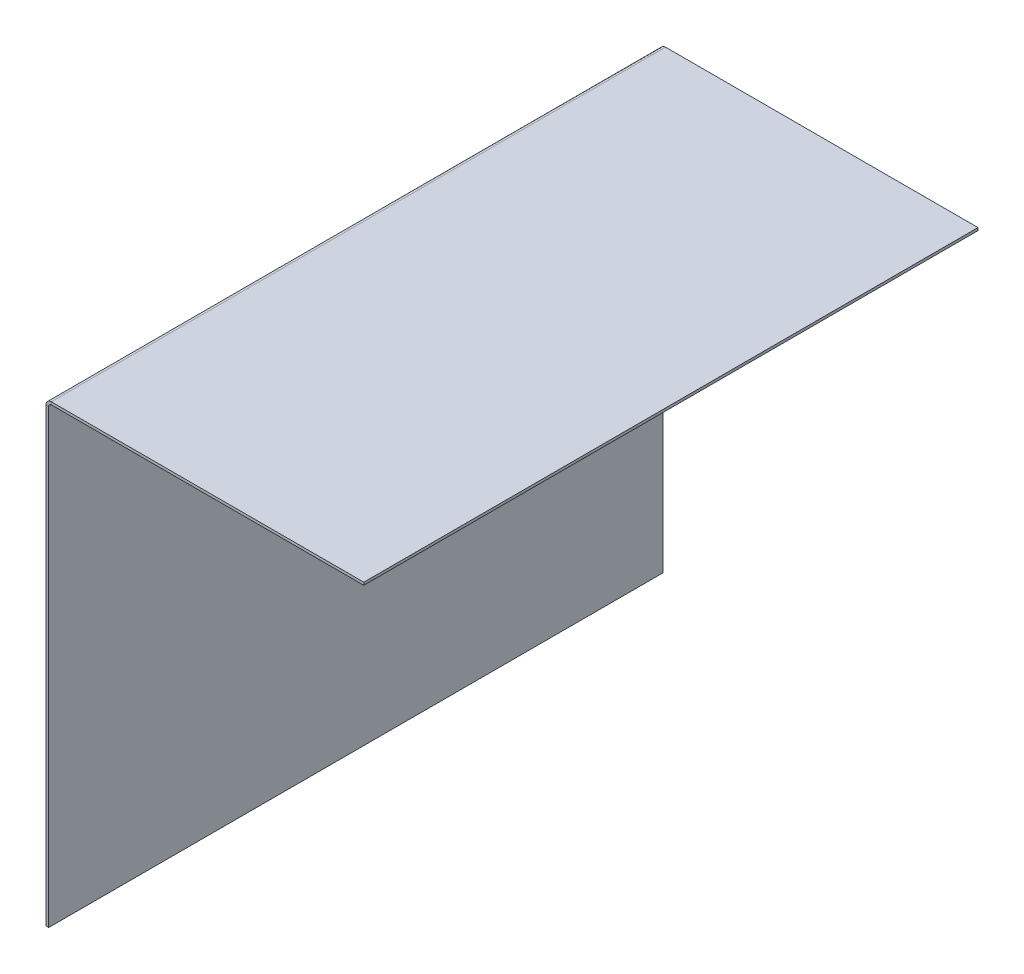
ISO-10303-21;
HEADER;
FILE_DESCRIPTION(('STEP AP214'),'2;1');
FILE_NAME('part.step','',(''),(''),'','','');
FILE_SCHEMA(('AUTOMOTIVE_DESIGN { 1 0 10303 214 1 1 1 1 }'));
ENDSEC;
DATA;
#1=APPLICATION_CONTEXT('core data for automotive mechanical design processes');
#2=APPLICATION_PROTOCOL_DEFINITION('international standard','automotive_design',2000,#1);
#3=PRODUCT_CONTEXT('',#1,'mechanical');
#4=PRODUCT('Part','Part','',(#3));
#5=PRODUCT_RELATED_PRODUCT_CATEGORY('part','',(#4));
#6=PRODUCT_DEFINITION_FORMATION('','',#4);
#7=PRODUCT_DEFINITION_CONTEXT('part definition',#1,'design');
#8=PRODUCT_DEFINITION('design','',#6,#7);
#9=PRODUCT_DEFINITION_SHAPE('','',#8);
#10=(LENGTH_UNIT() NAMED_UNIT(*) SI_UNIT(.MILLI.,.METRE.));
#11=(NAMED_UNIT(*) PLANE_ANGLE_UNIT() SI_UNIT($,.RADIAN.));
#12=(NAMED_UNIT(*) SI_UNIT($,.STERADIAN.) SOLID_ANGLE_UNIT());
#13=UNCERTAINTY_MEASURE_WITH_UNIT(LENGTH_MEASURE(1.E-05),#10,'distance_accuracy_value','');
#14=(GEOMETRIC_REPRESENTATION_CONTEXT(3) GLOBAL_UNCERTAINTY_ASSIGNED_CONTEXT((#13)) GLOBAL_UNIT_ASSIGNED_CONTEXT((#10,
#11,#12)) REPRESENTATION_CONTEXT('',''));
#15=CARTESIAN_POINT('',(0.,0.,0.));
#16=DIRECTION('',(0.,0.,1.));
#17=DIRECTION('',(1.,0.,0.));
#18=AXIS2_PLACEMENT_3D('',#15,#16,#17);
#19=CARTESIAN_POINT('',(0.,-1.,115.));
#20=DIRECTION('',(0.,0.,1.));
#21=DIRECTION('',(1.,0.,0.));
#22=AXIS2_PLACEMENT_3D('',#19,#20,#21);
#23=PLANE('',#22);
#24=DIRECTION('',(-1.,0.,0.));
#25=VECTOR('',#24,1.);
#26=CARTESIAN_POINT('',(0.,-1.,115.));
#27=LINE('',#26,#25);
#28=CARTESIAN_POINT('',(0.,-1.,115.));
#29=VERTEX_POINT('',#28);
#30=CARTESIAN_POINT('',(-1.,-1.,115.));
#31=VERTEX_POINT('',#30);
#32=EDGE_CURVE('E11',#29,#31,#27,.T.);
#33=ORIENTED_EDGE('',*,*,#32,.F.);
#34=CARTESIAN_POINT('',(1.,-1.,115.));
#35=DIRECTION('',(0.,0.,-1.));
#36=DIRECTION('',(-1.,0.,0.));
#37=AXIS2_PLACEMENT_3D('',#34,#35,#36);
#38=CIRCLE('',#37,1.);
#39=CARTESIAN_POINT('',(1.,0.,115.));
#40=VERTEX_POINT('',#39);
#41=EDGE_CURVE('E132',#40,#29,#38,.F.);
#42=ORIENTED_EDGE('',*,*,#41,.F.);
#43=DIRECTION('',(0.,-1.,0.));
#44=VECTOR('',#43,1.);
#45=CARTESIAN_POINT('',(1.,1.,115.));
#46=LINE('',#45,#44);
#47=CARTESIAN_POINT('',(1.,1.,115.));
#48=VERTEX_POINT('',#47);
#49=EDGE_CURVE('E43',#48,#40,#46,.T.);
#50=ORIENTED_EDGE('',*,*,#49,.F.);
#51=CARTESIAN_POINT('',(1.,-1.,115.));
#52=DIRECTION('',(0.,0.,1.));
#53=DIRECTION('',(1.,0.,0.));
#54=AXIS2_PLACEMENT_3D('',#51,#52,#53);
#55=CIRCLE('',#54,2.);
#56=EDGE_CURVE('E125',#48,#31,#55,.T.);
#57=ORIENTED_EDGE('',*,*,#56,.T.);
#58=EDGE_LOOP('',(#33,#42,#50,#57));
#59=FACE_BOUND('',#58,.T.);
#60=ADVANCED_FACE('F35',(#59),#23,.T.);
#61=CARTESIAN_POINT('',(1.,1.,115.));
#62=DIRECTION('',(0.,0.,1.));
#63=DIRECTION('',(1.,0.,0.));
#64=AXIS2_PLACEMENT_3D('',#61,#62,#63);
#65=PLANE('',#64);
#66=DIRECTION('',(0.,-1.,0.));
#67=VECTOR('',#66,1.);
#68=CARTESIAN_POINT('',(0.,0.,115.));
#69=LINE('',#68,#67);
#70=CARTESIAN_POINT('',(0.,-170.,115.));
#71=VERTEX_POINT('',#70);
#72=EDGE_CURVE('E181',#29,#71,#69,.T.);
#73=ORIENTED_EDGE('',*,*,#72,.F.);
#74=ORIENTED_EDGE('',*,*,#32,.T.);
#75=DIRECTION('',(0.,-1.,0.));
#76=VECTOR('',#75,1.);
#77=CARTESIAN_POINT('',(-1.,0.,115.));
#78=LINE('',#77,#76);
#79=CARTESIAN_POINT('',(-0.999999999999979,-170.,115.));
#80=VERTEX_POINT('',#79);
#81=EDGE_CURVE('E91',#31,#80,#78,.T.);
#82=ORIENTED_EDGE('',*,*,#81,.T.);
#83=DIRECTION('',(-1.,0.,0.));
#84=VECTOR('',#83,1.);
#85=CARTESIAN_POINT('',(0.,-170.,115.));
#86=LINE('',#85,#84);
#87=EDGE_CURVE('E338',#71,#80,#86,.T.);
#88=ORIENTED_EDGE('',*,*,#87,.F.);
#89=EDGE_LOOP('',(#73,#74,#82,#88));
#90=FACE_BOUND('',#89,.T.);
#91=ADVANCED_FACE('F189',(#90),#65,.T.);
#92=CARTESIAN_POINT('',(1.,0.,-115.));
#93=DIRECTION('',(0.,0.,-1.));
#94=DIRECTION('',(-1.,0.,0.));
#95=AXIS2_PLACEMENT_3D('',#92,#93,#94);
#96=PLANE('',#95);
#97=DIRECTION('',(0.,1.,0.));
#98=VECTOR('',#97,1.);
#99=CARTESIAN_POINT('',(1.,0.,-115.));
#100=LINE('',#99,#98);
#101=CARTESIAN_POINT('',(1.,0.,-115.));
#102=VERTEX_POINT('',#101);
#103=CARTESIAN_POINT('',(1.,1.,-115.));
#104=VERTEX_POINT('',#103);
#105=EDGE_CURVE('E78',#102,#104,#100,.T.);
#106=ORIENTED_EDGE('',*,*,#105,.F.);
#107=CARTESIAN_POINT('',(1.,-1.,-115.));
#108=DIRECTION('',(0.,0.,-1.));
#109=DIRECTION('',(-1.,0.,0.));
#110=AXIS2_PLACEMENT_3D('',#107,#108,#109);
#111=CIRCLE('',#110,1.);
#112=CARTESIAN_POINT('',(0.,-1.,-115.));
#113=VERTEX_POINT('',#112);
#114=EDGE_CURVE('E147',#102,#113,#111,.F.);
#115=ORIENTED_EDGE('',*,*,#114,.T.);
#116=DIRECTION('',(1.,0.,0.));
#117=VECTOR('',#116,1.);
#118=CARTESIAN_POINT('',(-1.,-1.,-115.));
#119=LINE('',#118,#117);
#120=CARTESIAN_POINT('',(-1.,-1.,-115.));
#121=VERTEX_POINT('',#120);
#122=EDGE_CURVE('E85',#121,#113,#119,.T.);
#123=ORIENTED_EDGE('',*,*,#122,.F.);
#124=CARTESIAN_POINT('',(1.,-1.,-115.));
#125=DIRECTION('',(0.,0.,1.));
#126=DIRECTION('',(1.,0.,0.));
#127=AXIS2_PLACEMENT_3D('',#124,#125,#126);
#128=CIRCLE('',#127,2.);
#129=EDGE_CURVE('E154',#104,#121,#128,.T.);
#130=ORIENTED_EDGE('',*,*,#129,.F.);
#131=EDGE_LOOP('',(#106,#115,#123,#130));
#132=FACE_BOUND('',#131,.T.);
#133=ADVANCED_FACE('F187',(#132),#96,.T.);
#134=CARTESIAN_POINT('',(-1.,-1.,-115.));
#135=DIRECTION('',(0.,0.,-1.));
#136=DIRECTION('',(-1.,0.,0.));
#137=AXIS2_PLACEMENT_3D('',#134,#135,#136);
#138=PLANE('',#137);
#139=DIRECTION('',(-1.,0.,0.));
#140=VECTOR('',#139,1.);
#141=CARTESIAN_POINT('',(0.,0.,-115.));
#142=LINE('',#141,#140);
#143=CARTESIAN_POINT('',(118.,0.,-115.));
#144=VERTEX_POINT('',#143);
#145=EDGE_CURVE('E149',#144,#102,#142,.T.);
#146=ORIENTED_EDGE('',*,*,#145,.T.);
#147=ORIENTED_EDGE('',*,*,#105,.T.);
#148=DIRECTION('',(1.,0.,0.));
#149=VECTOR('',#148,1.);
#150=CARTESIAN_POINT('',(0.,1.,-115.));
#151=LINE('',#150,#149);
#152=CARTESIAN_POINT('',(118.,1.,-115.));
#153=VERTEX_POINT('',#152);
#154=EDGE_CURVE('E152',#153,#104,#151,.F.);
#155=ORIENTED_EDGE('',*,*,#154,.F.);
#156=DIRECTION('',(0.,-1.,0.));
#157=VECTOR('',#156,1.);
#158=CARTESIAN_POINT('',(118.,1.,-115.));
#159=LINE('',#158,#157);
#160=EDGE_CURVE('E113',#153,#144,#159,.T.);
#161=ORIENTED_EDGE('',*,*,#160,.T.);
#162=EDGE_LOOP('',(#146,#147,#155,#161));
#163=FACE_BOUND('',#162,.T.);
#164=ADVANCED_FACE('F183',(#163),#138,.T.);
#165=CARTESIAN_POINT('',(-1.,0.,115.));
#166=DIRECTION('',(1.,0.,0.));
#167=DIRECTION('',(0.,1.,0.));
#168=AXIS2_PLACEMENT_3D('',#165,#166,#167);
#169=PLANE('',#168);
#170=DIRECTION('',(0.,-1.,0.));
#171=VECTOR('',#170,1.);
#172=CARTESIAN_POINT('',(-1.,0.,-115.));
#173=LINE('',#172,#171);
#174=CARTESIAN_POINT('',(-0.999999999999979,-170.,-115.));
#175=VERTEX_POINT('',#174);
#176=EDGE_CURVE('E138',#121,#175,#173,.T.);
#177=ORIENTED_EDGE('',*,*,#176,.T.);
#178=DIRECTION('',(0.,0.,-1.));
#179=VECTOR('',#178,1.);
#180=CARTESIAN_POINT('',(-0.999999999999979,-170.,115.));
#181=LINE('',#180,#179);
#182=EDGE_CURVE('E168',#80,#175,#181,.T.);
#183=ORIENTED_EDGE('',*,*,#182,.F.);
#184=ORIENTED_EDGE('',*,*,#81,.F.);
#185=DIRECTION('',(0.,0.,-1.));
#186=VECTOR('',#185,1.);
#187=CARTESIAN_POINT('',(-1.,-1.,115.));
#188=LINE('',#187,#186);
#189=EDGE_CURVE('E137',#31,#121,#188,.T.);
#190=ORIENTED_EDGE('',*,*,#189,.T.);
#191=EDGE_LOOP('',(#177,#183,#184,#190));
#192=FACE_BOUND('',#191,.T.);
#193=ADVANCED_FACE('F195',(#192),#169,.F.);
#194=CARTESIAN_POINT('',(0.,-170.,115.));
#195=DIRECTION('',(0.,-1.,0.));
#196=DIRECTION('',(0.,0.,-1.));
#197=AXIS2_PLACEMENT_3D('',#194,#195,#196);
#198=PLANE('',#197);
#199=DIRECTION('',(-1.,0.,0.));
#200=VECTOR('',#199,1.);
#201=CARTESIAN_POINT('',(0.,-170.,-115.));
#202=LINE('',#201,#200);
#203=CARTESIAN_POINT('',(0.,-170.,-115.));
#204=VERTEX_POINT('',#203);
#205=EDGE_CURVE('E141',#204,#175,#202,.T.);
#206=ORIENTED_EDGE('',*,*,#205,.F.);
#207=DIRECTION('',(0.,0.,-1.));
#208=VECTOR('',#207,1.);
#209=CARTESIAN_POINT('',(0.,-170.,115.));
#210=LINE('',#209,#208);
#211=EDGE_CURVE('E166',#71,#204,#210,.T.);
#212=ORIENTED_EDGE('',*,*,#211,.F.);
#213=ORIENTED_EDGE('',*,*,#87,.T.);
#214=ORIENTED_EDGE('',*,*,#182,.T.);
#215=EDGE_LOOP('',(#206,#212,#213,#214));
#216=FACE_BOUND('',#215,.T.);
#217=ADVANCED_FACE('F226',(#216),#198,.T.);
#218=CARTESIAN_POINT('',(0.,0.,115.));
#219=DIRECTION('',(1.,0.,0.));
#220=DIRECTION('',(0.,1.,0.));
#221=AXIS2_PLACEMENT_3D('',#218,#219,#220);
#222=PLANE('',#221);
#223=DIRECTION('',(0.,-1.,0.));
#224=VECTOR('',#223,1.);
#225=CARTESIAN_POINT('',(0.,0.,-115.));
#226=LINE('',#225,#224);
#227=EDGE_CURVE('E144',#113,#204,#226,.T.);
#228=ORIENTED_EDGE('',*,*,#227,.F.);
#229=DIRECTION('',(0.,0.,-1.));
#230=VECTOR('',#229,1.);
#231=CARTESIAN_POINT('',(0.,-1.,115.));
#232=LINE('',#231,#230);
#233=EDGE_CURVE('E163',#29,#113,#232,.T.);
#234=ORIENTED_EDGE('',*,*,#233,.F.);
#235=ORIENTED_EDGE('',*,*,#72,.T.);
#236=ORIENTED_EDGE('',*,*,#211,.T.);
#237=EDGE_LOOP('',(#228,#234,#235,#236));
#238=FACE_BOUND('',#237,.T.);
#239=ADVANCED_FACE('F237',(#238),#222,.T.);
#240=CARTESIAN_POINT('',(1.,-1.,115.));
#241=DIRECTION('',(0.,0.,-1.));
#242=DIRECTION('',(-1.,0.,0.));
#243=AXIS2_PLACEMENT_3D('',#240,#241,#242);
#244=CYLINDRICAL_SURFACE('',#243,1.);
#245=ORIENTED_EDGE('',*,*,#114,.F.);
#246=DIRECTION('',(0.,0.,-1.));
#247=VECTOR('',#246,1.);
#248=CARTESIAN_POINT('',(1.,0.,115.));
#249=LINE('',#248,#247);
#250=EDGE_CURVE('E160',#40,#102,#249,.T.);
#251=ORIENTED_EDGE('',*,*,#250,.F.);
#252=ORIENTED_EDGE('',*,*,#41,.T.);
#253=ORIENTED_EDGE('',*,*,#233,.T.);
#254=EDGE_LOOP('',(#245,#251,#252,#253));
#255=FACE_BOUND('',#254,.T.);
#256=ADVANCED_FACE('F177',(#255),#244,.F.);
#257=CARTESIAN_POINT('',(0.,0.,115.));
#258=DIRECTION('',(0.,-1.,0.));
#259=DIRECTION('',(0.,0.,-1.));
#260=AXIS2_PLACEMENT_3D('',#257,#258,#259);
#261=PLANE('',#260);
#262=ORIENTED_EDGE('',*,*,#145,.F.);
#263=DIRECTION('',(0.,0.,-1.));
#264=VECTOR('',#263,1.);
#265=CARTESIAN_POINT('',(118.,0.,115.));
#266=LINE('',#265,#264);
#267=CARTESIAN_POINT('',(118.,0.,115.));
#268=VERTEX_POINT('',#267);
#269=EDGE_CURVE('E115',#268,#144,#266,.T.);
#270=ORIENTED_EDGE('',*,*,#269,.F.);
#271=DIRECTION('',(-1.,0.,0.));
#272=VECTOR('',#271,1.);
#273=CARTESIAN_POINT('',(0.,0.,115.));
#274=LINE('',#273,#272);
#275=EDGE_CURVE('E130',#268,#40,#274,.T.);
#276=ORIENTED_EDGE('',*,*,#275,.T.);
#277=ORIENTED_EDGE('',*,*,#250,.T.);
#278=EDGE_LOOP('',(#262,#270,#276,#277));
#279=FACE_BOUND('',#278,.T.);
#280=ADVANCED_FACE('F182',(#279),#261,.T.);
#281=CARTESIAN_POINT('',(118.,1.,115.));
#282=DIRECTION('',(1.,0.,0.));
#283=DIRECTION('',(0.,0.,-1.));
#284=AXIS2_PLACEMENT_3D('',#281,#282,#283);
#285=PLANE('',#284);
#286=ORIENTED_EDGE('',*,*,#160,.F.);
#287=DIRECTION('',(0.,0.,-1.));
#288=VECTOR('',#287,1.);
#289=CARTESIAN_POINT('',(118.,1.,115.));
#290=LINE('',#289,#288);
#291=CARTESIAN_POINT('',(118.,1.,115.));
#292=VERTEX_POINT('',#291);
#293=EDGE_CURVE('E107',#292,#153,#290,.T.);
#294=ORIENTED_EDGE('',*,*,#293,.F.);
#295=DIRECTION('',(0.,-1.,0.));
#296=VECTOR('',#295,1.);
#297=CARTESIAN_POINT('',(118.,1.,115.));
#298=LINE('',#297,#296);
#299=EDGE_CURVE('E111',#292,#268,#298,.T.);
#300=ORIENTED_EDGE('',*,*,#299,.T.);
#301=ORIENTED_EDGE('',*,*,#269,.T.);
#302=EDGE_LOOP('',(#286,#294,#300,#301));
#303=FACE_BOUND('',#302,.T.);
#304=ADVANCED_FACE('F109',(#303),#285,.T.);
#305=CARTESIAN_POINT('',(0.,1.,115.));
#306=DIRECTION('',(0.,-1.,0.));
#307=DIRECTION('',(0.,0.,-1.));
#308=AXIS2_PLACEMENT_3D('',#305,#306,#307);
#309=PLANE('',#308);
#310=ORIENTED_EDGE('',*,*,#154,.T.);
#311=DIRECTION('',(0.,0.,-1.));
#312=VECTOR('',#311,1.);
#313=CARTESIAN_POINT('',(1.,1.,115.));
#314=LINE('',#313,#312);
#315=EDGE_CURVE('E116',#48,#104,#314,.T.);
#316=ORIENTED_EDGE('',*,*,#315,.F.);
#317=DIRECTION('',(1.,0.,0.));
#318=VECTOR('',#317,1.);
#319=CARTESIAN_POINT('',(0.,1.,115.));
#320=LINE('',#319,#318);
#321=EDGE_CURVE('E120',#292,#48,#320,.F.);
#322=ORIENTED_EDGE('',*,*,#321,.F.);
#323=ORIENTED_EDGE('',*,*,#293,.T.);
#324=EDGE_LOOP('',(#310,#316,#322,#323));
#325=FACE_BOUND('',#324,.T.);
#326=ADVANCED_FACE('F121',(#325),#309,.F.);
#327=CARTESIAN_POINT('',(1.,-1.,115.));
#328=DIRECTION('',(0.,0.,-1.));
#329=DIRECTION('',(-1.,0.,0.));
#330=AXIS2_PLACEMENT_3D('',#327,#328,#329);
#331=CYLINDRICAL_SURFACE('',#330,2.);
#332=ORIENTED_EDGE('',*,*,#129,.T.);
#333=ORIENTED_EDGE('',*,*,#189,.F.);
#334=ORIENTED_EDGE('',*,*,#56,.F.);
#335=ORIENTED_EDGE('',*,*,#315,.T.);
#336=EDGE_LOOP('',(#332,#333,#334,#335));
#337=FACE_BOUND('',#336,.T.);
#338=ADVANCED_FACE('F185',(#337),#331,.T.);
#339=CARTESIAN_POINT('',(1.,-1.,115.));
#340=DIRECTION('',(0.,0.,-1.));
#341=DIRECTION('',(-1.,0.,0.));
#342=AXIS2_PLACEMENT_3D('',#339,#340,#341);
#343=PLANE('',#342);
#344=ORIENTED_EDGE('',*,*,#321,.T.);
#345=ORIENTED_EDGE('',*,*,#49,.T.);
#346=ORIENTED_EDGE('',*,*,#275,.F.);
#347=ORIENTED_EDGE('',*,*,#299,.F.);
#348=EDGE_LOOP('',(#344,#345,#346,#347));
#349=FACE_BOUND('',#348,.T.);
#350=ADVANCED_FACE('F128',(#349),#343,.F.);
#351=CARTESIAN_POINT('',(1.,-1.,-115.));
#352=DIRECTION('',(0.,0.,-1.));
#353=DIRECTION('',(-1.,0.,0.));
#354=AXIS2_PLACEMENT_3D('',#351,#352,#353);
#355=PLANE('',#354);
#356=ORIENTED_EDGE('',*,*,#176,.F.);
#357=ORIENTED_EDGE('',*,*,#122,.T.);
#358=ORIENTED_EDGE('',*,*,#227,.T.);
#359=ORIENTED_EDGE('',*,*,#205,.T.);
#360=EDGE_LOOP('',(#356,#357,#358,#359));
#361=FACE_BOUND('',#360,.T.);
#362=ADVANCED_FACE('F303',(#361),#355,.T.);
#363=CLOSED_SHELL('',(#60,#91,#133,#164,#193,#217,#239,#256,#280,#304,#326,#338,#350,#362));
#364=MANIFOLD_SOLID_BREP('B2',#363);
#365=ADVANCED_BREP_SHAPE_REPRESENTATION('',(#18,#364),#14);
#366=SHAPE_DEFINITION_REPRESENTATION(#9,#365);
ENDSEC;
END-ISO-10303-21;
